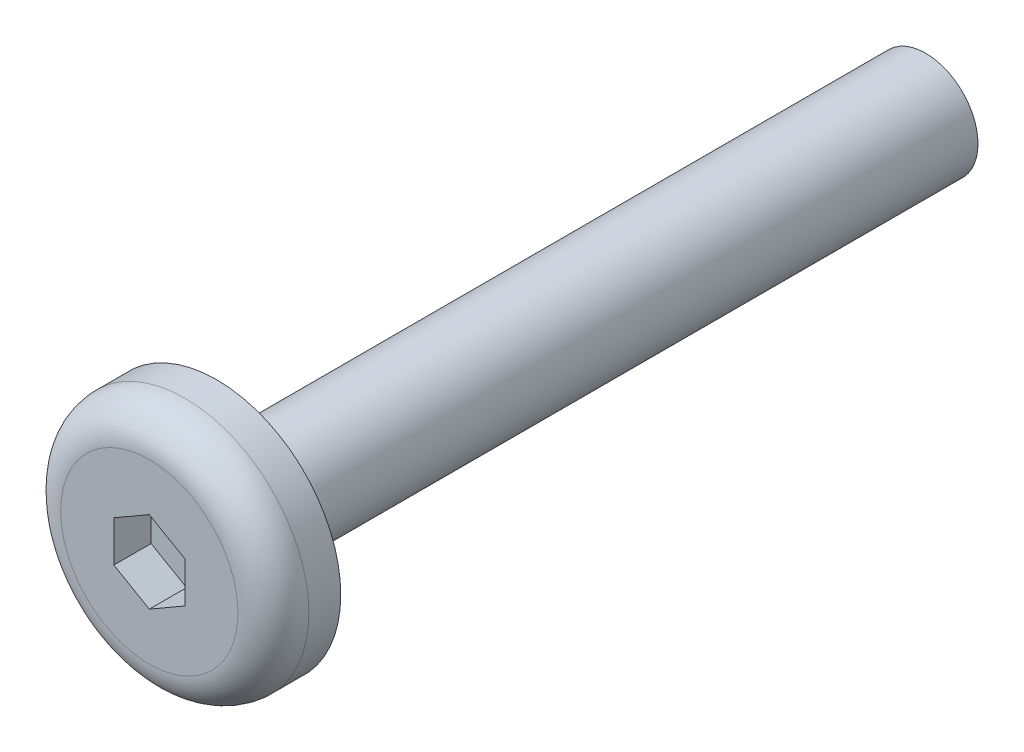
ISO-10303-21;
HEADER;
FILE_DESCRIPTION(('STEP AP214'),'2;1');
FILE_NAME('part.step','',(''),(''),'','','');
FILE_SCHEMA(('AUTOMOTIVE_DESIGN { 1 0 10303 214 1 1 1 1 }'));
ENDSEC;
DATA;
#1=APPLICATION_CONTEXT('core data for automotive mechanical design processes');
#2=APPLICATION_PROTOCOL_DEFINITION('international standard','automotive_design',2000,#1);
#3=PRODUCT_CONTEXT('',#1,'mechanical');
#4=PRODUCT('Part','Part','',(#3));
#5=PRODUCT_RELATED_PRODUCT_CATEGORY('part','',(#4));
#6=PRODUCT_DEFINITION_FORMATION('','',#4);
#7=PRODUCT_DEFINITION_CONTEXT('part definition',#1,'design');
#8=PRODUCT_DEFINITION('design','',#6,#7);
#9=PRODUCT_DEFINITION_SHAPE('','',#8);
#10=(LENGTH_UNIT() NAMED_UNIT(*) SI_UNIT(.MILLI.,.METRE.));
#11=(NAMED_UNIT(*) PLANE_ANGLE_UNIT() SI_UNIT($,.RADIAN.));
#12=(NAMED_UNIT(*) SI_UNIT($,.STERADIAN.) SOLID_ANGLE_UNIT());
#13=UNCERTAINTY_MEASURE_WITH_UNIT(LENGTH_MEASURE(1.E-05),#10,'distance_accuracy_value','');
#14=(GEOMETRIC_REPRESENTATION_CONTEXT(3) GLOBAL_UNCERTAINTY_ASSIGNED_CONTEXT((#13)) GLOBAL_UNIT_ASSIGNED_CONTEXT((#10,
#11,#12)) REPRESENTATION_CONTEXT('',''));
#15=CARTESIAN_POINT('',(0.,0.,0.));
#16=DIRECTION('',(0.,0.,1.));
#17=DIRECTION('',(1.,0.,0.));
#18=AXIS2_PLACEMENT_3D('',#15,#16,#17);
#19=CARTESIAN_POINT('',(0.,3.5,0.));
#20=DIRECTION('',(0.,0.,-1.));
#21=DIRECTION('',(-1.,0.,0.));
#22=AXIS2_PLACEMENT_3D('',#19,#20,#21);
#23=PLANE('',#22);
#24=DIRECTION('',(-0.866025403784439,-0.5,0.));
#25=VECTOR('',#24,1.);
#26=CARTESIAN_POINT('',(0.,1.15470053837925,0.));
#27=LINE('',#26,#25);
#28=CARTESIAN_POINT('',(0.,1.15470053837925,0.));
#29=VERTEX_POINT('',#28);
#30=CARTESIAN_POINT('',(-1.,0.577350269189626,0.));
#31=VERTEX_POINT('',#30);
#32=EDGE_CURVE('E121',#29,#31,#27,.T.);
#33=ORIENTED_EDGE('',*,*,#32,.F.);
#34=DIRECTION('',(-0.866025403784439,0.5,0.));
#35=VECTOR('',#34,1.);
#36=CARTESIAN_POINT('',(1.,0.577350269189626,0.));
#37=LINE('',#36,#35);
#38=CARTESIAN_POINT('',(1.,0.577350269189626,0.));
#39=VERTEX_POINT('',#38);
#40=EDGE_CURVE('E47',#39,#29,#37,.T.);
#41=ORIENTED_EDGE('',*,*,#40,.F.);
#42=DIRECTION('',(0.,1.,0.));
#43=VECTOR('',#42,1.);
#44=CARTESIAN_POINT('',(1.,-0.577350269189626,0.));
#45=LINE('',#44,#43);
#46=CARTESIAN_POINT('',(1.,-0.577350269189626,0.));
#47=VERTEX_POINT('',#46);
#48=EDGE_CURVE('E130',#47,#39,#45,.T.);
#49=ORIENTED_EDGE('',*,*,#48,.F.);
#50=DIRECTION('',(0.866025403784439,0.5,0.));
#51=VECTOR('',#50,1.);
#52=CARTESIAN_POINT('',(0.,-1.15470053837925,0.));
#53=LINE('',#52,#51);
#54=CARTESIAN_POINT('',(0.,-1.15470053837925,0.));
#55=VERTEX_POINT('',#54);
#56=EDGE_CURVE('E128',#55,#47,#53,.T.);
#57=ORIENTED_EDGE('',*,*,#56,.F.);
#58=DIRECTION('',(0.866025403784439,-0.5,0.));
#59=VECTOR('',#58,1.);
#60=CARTESIAN_POINT('',(-1.,-0.577350269189626,0.));
#61=LINE('',#60,#59);
#62=CARTESIAN_POINT('',(-1.,-0.577350269189626,0.));
#63=VERTEX_POINT('',#62);
#64=EDGE_CURVE('E95',#63,#55,#61,.T.);
#65=ORIENTED_EDGE('',*,*,#64,.F.);
#66=DIRECTION('',(0.,-1.,0.));
#67=VECTOR('',#66,1.);
#68=CARTESIAN_POINT('',(-1.,0.577350269189626,0.));
#69=LINE('',#68,#67);
#70=EDGE_CURVE('E124',#31,#63,#69,.T.);
#71=ORIENTED_EDGE('',*,*,#70,.F.);
#72=EDGE_LOOP('',(#33,#41,#49,#57,#65,#71));
#73=FACE_BOUND('',#72,.T.);
#74=CARTESIAN_POINT('',(0.,0.,0.));
#75=DIRECTION('',(0.,0.,-1.));
#76=DIRECTION('',(-1.,0.,0.));
#77=AXIS2_PLACEMENT_3D('',#74,#75,#76);
#78=CIRCLE('',#77,2.5);
#79=CARTESIAN_POINT('',(-2.5,0.,0.));
#80=VERTEX_POINT('',#79);
#81=EDGE_CURVE('E40',#80,#80,#78,.F.);
#82=ORIENTED_EDGE('',*,*,#81,.T.);
#83=EDGE_LOOP('',(#82));
#84=FACE_BOUND('',#83,.T.);
#85=ADVANCED_FACE('F32',(#73,#84),#23,.F.);
#86=CARTESIAN_POINT('',(0.,0.,-21.9));
#87=DIRECTION('',(0.,0.,1.));
#88=DIRECTION('',(1.,0.,0.));
#89=AXIS2_PLACEMENT_3D('',#86,#87,#88);
#90=PLANE('',#89);
#91=CARTESIAN_POINT('',(0.,0.,-21.9));
#92=DIRECTION('',(0.,0.,1.));
#93=DIRECTION('',(1.,0.,0.));
#94=AXIS2_PLACEMENT_3D('',#91,#92,#93);
#95=CIRCLE('',#94,1.475);
#96=CARTESIAN_POINT('',(1.475,0.,-21.9));
#97=VERTEX_POINT('',#96);
#98=EDGE_CURVE('E145',#97,#97,#95,.T.);
#99=ORIENTED_EDGE('',*,*,#98,.F.);
#100=EDGE_LOOP('',(#99));
#101=FACE_BOUND('',#100,.T.);
#102=ADVANCED_FACE('F166',(#101),#90,.F.);
#103=CARTESIAN_POINT('',(0.,0.,0.));
#104=DIRECTION('',(0.,0.,1.));
#105=DIRECTION('',(1.,0.,0.));
#106=AXIS2_PLACEMENT_3D('',#103,#104,#105);
#107=CYLINDRICAL_SURFACE('',#106,1.475);
#108=CARTESIAN_POINT('',(0.,0.,-1.9));
#109=DIRECTION('',(0.,0.,1.));
#110=DIRECTION('',(1.,0.,0.));
#111=AXIS2_PLACEMENT_3D('',#108,#109,#110);
#112=CIRCLE('',#111,1.475);
#113=CARTESIAN_POINT('',(1.475,0.,-1.9));
#114=VERTEX_POINT('',#113);
#115=EDGE_CURVE('E142',#114,#114,#112,.T.);
#116=ORIENTED_EDGE('',*,*,#115,.F.);
#117=EDGE_LOOP('',(#116));
#118=FACE_BOUND('',#117,.T.);
#119=ORIENTED_EDGE('',*,*,#98,.T.);
#120=EDGE_LOOP('',(#119));
#121=FACE_BOUND('',#120,.T.);
#122=ADVANCED_FACE('F171',(#118,#121),#107,.T.);
#123=CARTESIAN_POINT('',(0.,1.475,-1.9));
#124=DIRECTION('',(0.,0.,1.));
#125=DIRECTION('',(1.,0.,0.));
#126=AXIS2_PLACEMENT_3D('',#123,#124,#125);
#127=PLANE('',#126);
#128=CARTESIAN_POINT('',(0.,0.,-1.9));
#129=DIRECTION('',(0.,0.,1.));
#130=DIRECTION('',(1.,0.,0.));
#131=AXIS2_PLACEMENT_3D('',#128,#129,#130);
#132=CIRCLE('',#131,3.5);
#133=CARTESIAN_POINT('',(3.5,0.,-1.9));
#134=VERTEX_POINT('',#133);
#135=EDGE_CURVE('E134',#134,#134,#132,.T.);
#136=ORIENTED_EDGE('',*,*,#135,.F.);
#137=EDGE_LOOP('',(#136));
#138=FACE_BOUND('',#137,.T.);
#139=ORIENTED_EDGE('',*,*,#115,.T.);
#140=EDGE_LOOP('',(#139));
#141=FACE_BOUND('',#140,.T.);
#142=ADVANCED_FACE('F161',(#138,#141),#127,.F.);
#143=CARTESIAN_POINT('',(0.,0.,0.));
#144=DIRECTION('',(0.,0.,1.));
#145=DIRECTION('',(1.,0.,0.));
#146=AXIS2_PLACEMENT_3D('',#143,#144,#145);
#147=CYLINDRICAL_SURFACE('',#146,3.5);
#148=CARTESIAN_POINT('',(0.,0.,-1.));
#149=DIRECTION('',(0.,0.,-1.));
#150=DIRECTION('',(-1.,0.,0.));
#151=AXIS2_PLACEMENT_3D('',#148,#149,#150);
#152=CIRCLE('',#151,3.5);
#153=CARTESIAN_POINT('',(-3.5,0.,-1.));
#154=VERTEX_POINT('',#153);
#155=EDGE_CURVE('E11',#154,#154,#152,.T.);
#156=ORIENTED_EDGE('',*,*,#155,.T.);
#157=EDGE_LOOP('',(#156));
#158=FACE_BOUND('',#157,.T.);
#159=ORIENTED_EDGE('',*,*,#135,.T.);
#160=EDGE_LOOP('',(#159));
#161=FACE_BOUND('',#160,.T.);
#162=ADVANCED_FACE('F153',(#158,#161),#147,.T.);
#163=CARTESIAN_POINT('',(0.,0.,-1.));
#164=DIRECTION('',(0.,0.,-1.));
#165=DIRECTION('',(-1.,0.,0.));
#166=AXIS2_PLACEMENT_3D('',#163,#164,#165);
#167=TOROIDAL_SURFACE('',#166,2.5,1.);
#168=ORIENTED_EDGE('',*,*,#155,.F.);
#169=EDGE_LOOP('',(#168));
#170=FACE_BOUND('',#169,.T.);
#171=ORIENTED_EDGE('',*,*,#81,.F.);
#172=EDGE_LOOP('',(#171));
#173=FACE_BOUND('',#172,.T.);
#174=ADVANCED_FACE('F34',(#170,#173),#167,.T.);
#175=CARTESIAN_POINT('',(1.,0.577350269189626,-1.05));
#176=DIRECTION('',(0.5,0.866025403784439,0.));
#177=DIRECTION('',(-0.866025403784439,0.5,0.));
#178=AXIS2_PLACEMENT_3D('',#175,#176,#177);
#179=PLANE('',#178);
#180=ORIENTED_EDGE('',*,*,#40,.T.);
#181=DIRECTION('',(0.,0.,1.));
#182=VECTOR('',#181,1.);
#183=CARTESIAN_POINT('',(0.,1.15470053837925,-1.05));
#184=LINE('',#183,#182);
#185=CARTESIAN_POINT('',(0.,1.15470053837925,-1.05));
#186=VERTEX_POINT('',#185);
#187=EDGE_CURVE('E77',#186,#29,#184,.T.);
#188=ORIENTED_EDGE('',*,*,#187,.F.);
#189=DIRECTION('',(-0.866025403784439,0.5,0.));
#190=VECTOR('',#189,1.);
#191=CARTESIAN_POINT('',(1.,0.577350269189626,-1.05));
#192=LINE('',#191,#190);
#193=CARTESIAN_POINT('',(1.,0.577350269189626,-1.05));
#194=VERTEX_POINT('',#193);
#195=EDGE_CURVE('E132',#194,#186,#192,.T.);
#196=ORIENTED_EDGE('',*,*,#195,.F.);
#197=DIRECTION('',(0.,0.,1.));
#198=VECTOR('',#197,1.);
#199=CARTESIAN_POINT('',(1.,0.577350269189626,-1.05));
#200=LINE('',#199,#198);
#201=EDGE_CURVE('E55',#194,#39,#200,.T.);
#202=ORIENTED_EDGE('',*,*,#201,.T.);
#203=EDGE_LOOP('',(#180,#188,#196,#202));
#204=FACE_BOUND('',#203,.T.);
#205=ADVANCED_FACE('F152',(#204),#179,.F.);
#206=CARTESIAN_POINT('',(1.,-0.577350269189626,-1.05));
#207=DIRECTION('',(1.,0.,0.));
#208=DIRECTION('',(0.,1.,0.));
#209=AXIS2_PLACEMENT_3D('',#206,#207,#208);
#210=PLANE('',#209);
#211=ORIENTED_EDGE('',*,*,#48,.T.);
#212=ORIENTED_EDGE('',*,*,#201,.F.);
#213=DIRECTION('',(0.,1.,0.));
#214=VECTOR('',#213,1.);
#215=CARTESIAN_POINT('',(1.,-0.577350269189626,-1.05));
#216=LINE('',#215,#214);
#217=CARTESIAN_POINT('',(1.,-0.577350269189626,-1.05));
#218=VERTEX_POINT('',#217);
#219=EDGE_CURVE('E107',#218,#194,#216,.T.);
#220=ORIENTED_EDGE('',*,*,#219,.F.);
#221=DIRECTION('',(0.,0.,1.));
#222=VECTOR('',#221,1.);
#223=CARTESIAN_POINT('',(1.,-0.577350269189626,-1.05));
#224=LINE('',#223,#222);
#225=EDGE_CURVE('E99',#218,#47,#224,.T.);
#226=ORIENTED_EDGE('',*,*,#225,.T.);
#227=EDGE_LOOP('',(#211,#212,#220,#226));
#228=FACE_BOUND('',#227,.T.);
#229=ADVANCED_FACE('F159',(#228),#210,.F.);
#230=CARTESIAN_POINT('',(0.,-1.15470053837925,-1.05));
#231=DIRECTION('',(0.5,-0.866025403784439,0.));
#232=DIRECTION('',(0.866025403784439,0.5,0.));
#233=AXIS2_PLACEMENT_3D('',#230,#231,#232);
#234=PLANE('',#233);
#235=ORIENTED_EDGE('',*,*,#56,.T.);
#236=ORIENTED_EDGE('',*,*,#225,.F.);
#237=DIRECTION('',(0.866025403784439,0.5,0.));
#238=VECTOR('',#237,1.);
#239=CARTESIAN_POINT('',(0.,-1.15470053837925,-1.05));
#240=LINE('',#239,#238);
#241=CARTESIAN_POINT('',(0.,-1.15470053837925,-1.05));
#242=VERTEX_POINT('',#241);
#243=EDGE_CURVE('E103',#242,#218,#240,.T.);
#244=ORIENTED_EDGE('',*,*,#243,.F.);
#245=DIRECTION('',(0.,0.,1.));
#246=VECTOR('',#245,1.);
#247=CARTESIAN_POINT('',(0.,-1.15470053837925,-1.05));
#248=LINE('',#247,#246);
#249=EDGE_CURVE('E88',#242,#55,#248,.T.);
#250=ORIENTED_EDGE('',*,*,#249,.T.);
#251=EDGE_LOOP('',(#235,#236,#244,#250));
#252=FACE_BOUND('',#251,.T.);
#253=ADVANCED_FACE('F104',(#252),#234,.F.);
#254=CARTESIAN_POINT('',(-1.,-0.577350269189626,-1.05));
#255=DIRECTION('',(-0.5,-0.866025403784439,0.));
#256=DIRECTION('',(0.866025403784439,-0.5,0.));
#257=AXIS2_PLACEMENT_3D('',#254,#255,#256);
#258=PLANE('',#257);
#259=ORIENTED_EDGE('',*,*,#64,.T.);
#260=ORIENTED_EDGE('',*,*,#249,.F.);
#261=DIRECTION('',(0.866025403784439,-0.5,0.));
#262=VECTOR('',#261,1.);
#263=CARTESIAN_POINT('',(-1.,-0.577350269189626,-1.05));
#264=LINE('',#263,#262);
#265=CARTESIAN_POINT('',(-1.,-0.577350269189626,-1.05));
#266=VERTEX_POINT('',#265);
#267=EDGE_CURVE('E92',#266,#242,#264,.T.);
#268=ORIENTED_EDGE('',*,*,#267,.F.);
#269=DIRECTION('',(0.,0.,1.));
#270=VECTOR('',#269,1.);
#271=CARTESIAN_POINT('',(-1.,-0.577350269189626,-1.05));
#272=LINE('',#271,#270);
#273=EDGE_CURVE('E100',#266,#63,#272,.T.);
#274=ORIENTED_EDGE('',*,*,#273,.T.);
#275=EDGE_LOOP('',(#259,#260,#268,#274));
#276=FACE_BOUND('',#275,.T.);
#277=ADVANCED_FACE('F90',(#276),#258,.F.);
#278=CARTESIAN_POINT('',(-1.,0.577350269189626,-1.05));
#279=DIRECTION('',(-1.,0.,0.));
#280=DIRECTION('',(0.,-1.,0.));
#281=AXIS2_PLACEMENT_3D('',#278,#279,#280);
#282=PLANE('',#281);
#283=ORIENTED_EDGE('',*,*,#70,.T.);
#284=ORIENTED_EDGE('',*,*,#273,.F.);
#285=DIRECTION('',(0.,-1.,0.));
#286=VECTOR('',#285,1.);
#287=CARTESIAN_POINT('',(-1.,0.577350269189626,-1.05));
#288=LINE('',#287,#286);
#289=CARTESIAN_POINT('',(-1.,0.577350269189626,-1.05));
#290=VERTEX_POINT('',#289);
#291=EDGE_CURVE('E113',#290,#266,#288,.T.);
#292=ORIENTED_EDGE('',*,*,#291,.F.);
#293=DIRECTION('',(0.,0.,1.));
#294=VECTOR('',#293,1.);
#295=CARTESIAN_POINT('',(-1.,0.577350269189626,-1.05));
#296=LINE('',#295,#294);
#297=EDGE_CURVE('E137',#290,#31,#296,.T.);
#298=ORIENTED_EDGE('',*,*,#297,.T.);
#299=EDGE_LOOP('',(#283,#284,#292,#298));
#300=FACE_BOUND('',#299,.T.);
#301=ADVANCED_FACE('F185',(#300),#282,.F.);
#302=CARTESIAN_POINT('',(0.,1.15470053837925,-1.05));
#303=DIRECTION('',(-0.5,0.866025403784439,0.));
#304=DIRECTION('',(-0.866025403784439,-0.5,0.));
#305=AXIS2_PLACEMENT_3D('',#302,#303,#304);
#306=PLANE('',#305);
#307=ORIENTED_EDGE('',*,*,#32,.T.);
#308=ORIENTED_EDGE('',*,*,#297,.F.);
#309=DIRECTION('',(-0.866025403784439,-0.5,0.));
#310=VECTOR('',#309,1.);
#311=CARTESIAN_POINT('',(0.,1.15470053837925,-1.05));
#312=LINE('',#311,#310);
#313=EDGE_CURVE('E115',#186,#290,#312,.T.);
#314=ORIENTED_EDGE('',*,*,#313,.F.);
#315=ORIENTED_EDGE('',*,*,#187,.T.);
#316=EDGE_LOOP('',(#307,#308,#314,#315));
#317=FACE_BOUND('',#316,.T.);
#318=ADVANCED_FACE('F182',(#317),#306,.F.);
#319=CARTESIAN_POINT('',(0.,0.,-1.05));
#320=DIRECTION('',(0.,0.,1.));
#321=DIRECTION('',(1.,0.,0.));
#322=AXIS2_PLACEMENT_3D('',#319,#320,#321);
#323=PLANE('',#322);
#324=ORIENTED_EDGE('',*,*,#195,.T.);
#325=ORIENTED_EDGE('',*,*,#313,.T.);
#326=ORIENTED_EDGE('',*,*,#291,.T.);
#327=ORIENTED_EDGE('',*,*,#267,.T.);
#328=ORIENTED_EDGE('',*,*,#243,.T.);
#329=ORIENTED_EDGE('',*,*,#219,.T.);
#330=EDGE_LOOP('',(#324,#325,#326,#327,#328,#329));
#331=FACE_BOUND('',#330,.T.);
#332=ADVANCED_FACE('F110',(#331),#323,.T.);
#333=CLOSED_SHELL('',(#85,#102,#122,#142,#162,#174,#205,#229,#253,#277,#301,#318,#332));
#334=MANIFOLD_SOLID_BREP('B2',#333);
#335=ADVANCED_BREP_SHAPE_REPRESENTATION('',(#18,#334),#14);
#336=SHAPE_DEFINITION_REPRESENTATION(#9,#335);
ENDSEC;
END-ISO-10303-21;
